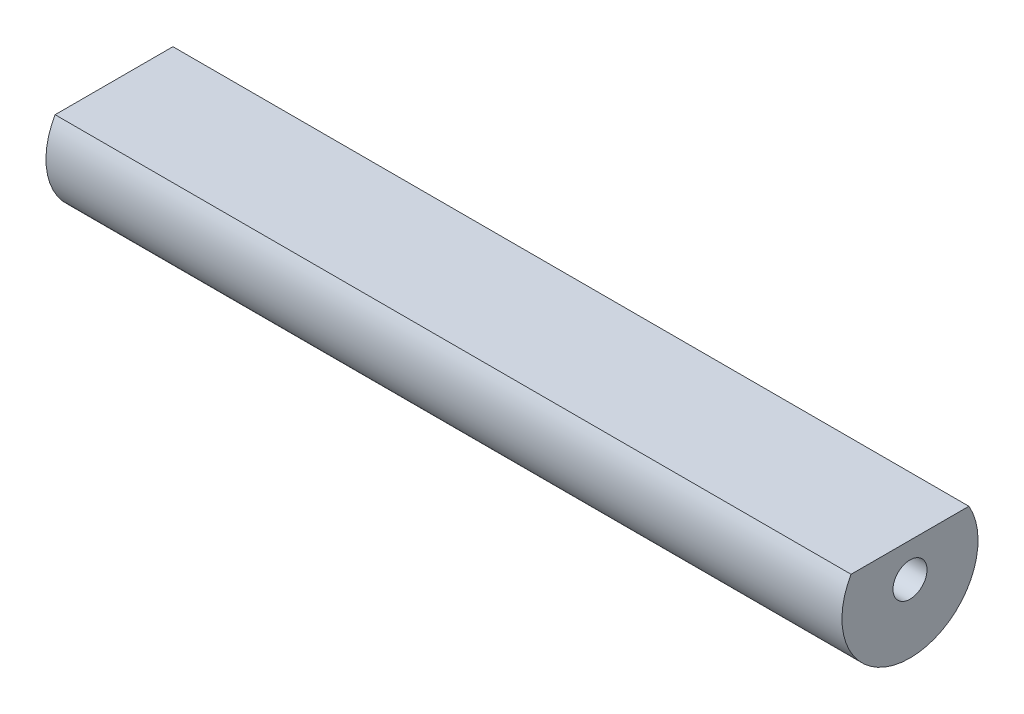
ISO-10303-21;
HEADER;
FILE_DESCRIPTION(('STEP AP214'),'2;1');
FILE_NAME('part.step','',(''),(''),'','','');
FILE_SCHEMA(('AUTOMOTIVE_DESIGN { 1 0 10303 214 1 1 1 1 }'));
ENDSEC;
DATA;
#1=APPLICATION_CONTEXT('core data for automotive mechanical design processes');
#2=APPLICATION_PROTOCOL_DEFINITION('international standard','automotive_design',2000,#1);
#3=PRODUCT_CONTEXT('',#1,'mechanical');
#4=PRODUCT('Part','Part','',(#3));
#5=PRODUCT_RELATED_PRODUCT_CATEGORY('part','',(#4));
#6=PRODUCT_DEFINITION_FORMATION('','',#4);
#7=PRODUCT_DEFINITION_CONTEXT('part definition',#1,'design');
#8=PRODUCT_DEFINITION('design','',#6,#7);
#9=PRODUCT_DEFINITION_SHAPE('','',#8);
#10=(LENGTH_UNIT() NAMED_UNIT(*) SI_UNIT(.MILLI.,.METRE.));
#11=(NAMED_UNIT(*) PLANE_ANGLE_UNIT() SI_UNIT($,.RADIAN.));
#12=(NAMED_UNIT(*) SI_UNIT($,.STERADIAN.) SOLID_ANGLE_UNIT());
#13=UNCERTAINTY_MEASURE_WITH_UNIT(LENGTH_MEASURE(1.E-05),#10,'distance_accuracy_value','');
#14=(GEOMETRIC_REPRESENTATION_CONTEXT(3) GLOBAL_UNCERTAINTY_ASSIGNED_CONTEXT((#13)) GLOBAL_UNIT_ASSIGNED_CONTEXT((#10,
#11,#12)) REPRESENTATION_CONTEXT('',''));
#15=CARTESIAN_POINT('',(0.,0.,0.));
#16=DIRECTION('',(0.,0.,1.));
#17=DIRECTION('',(1.,0.,0.));
#18=AXIS2_PLACEMENT_3D('',#15,#16,#17);
#19=CARTESIAN_POINT('',(0.,0.,0.));
#20=DIRECTION('',(1.,0.,0.));
#21=DIRECTION('',(0.,1.,0.));
#22=AXIS2_PLACEMENT_3D('',#19,#20,#21);
#23=PLANE('',#22);
#24=DIRECTION('',(0.,0.,-1.));
#25=VECTOR('',#24,1.);
#26=CARTESIAN_POINT('',(0.,5.00000000000002,10.));
#27=LINE('',#26,#25);
#28=CARTESIAN_POINT('',(0.,5.00000000000002,8.66025403784439));
#29=VERTEX_POINT('',#28);
#30=CARTESIAN_POINT('',(0.,5.00000000000002,-8.66025403784439));
#31=VERTEX_POINT('',#30);
#32=EDGE_CURVE('E51',#29,#31,#27,.T.);
#33=ORIENTED_EDGE('',*,*,#32,.F.);
#34=CARTESIAN_POINT('',(0.,0.,0.));
#35=DIRECTION('',(1.,0.,0.));
#36=DIRECTION('',(0.,1.,0.));
#37=AXIS2_PLACEMENT_3D('',#34,#35,#36);
#38=CIRCLE('',#37,10.);
#39=EDGE_CURVE('E11',#29,#31,#38,.T.);
#40=ORIENTED_EDGE('',*,*,#39,.T.);
#41=EDGE_LOOP('',(#33,#40));
#42=FACE_BOUND('',#41,.T.);
#43=CARTESIAN_POINT('',(0.,0.,0.));
#44=DIRECTION('',(1.,0.,0.));
#45=DIRECTION('',(0.,1.,0.));
#46=AXIS2_PLACEMENT_3D('',#43,#44,#45);
#47=CIRCLE('',#46,2.5);
#48=CARTESIAN_POINT('',(0.,2.5,0.));
#49=VERTEX_POINT('',#48);
#50=EDGE_CURVE('E70',#49,#49,#47,.T.);
#51=ORIENTED_EDGE('',*,*,#50,.F.);
#52=EDGE_LOOP('',(#51));
#53=FACE_BOUND('',#52,.T.);
#54=ADVANCED_FACE('F32',(#42,#53),#23,.T.);
#55=CARTESIAN_POINT('',(0.,0.,0.));
#56=DIRECTION('',(1.,0.,0.));
#57=DIRECTION('',(0.,1.,0.));
#58=AXIS2_PLACEMENT_3D('',#55,#56,#57);
#59=CYLINDRICAL_SURFACE('',#58,10.);
#60=DIRECTION('',(1.,0.,0.));
#61=VECTOR('',#60,1.);
#62=CARTESIAN_POINT('',(0.,5.00000000000002,-8.66025403784439));
#63=LINE('',#62,#61);
#64=CARTESIAN_POINT('',(-117.,5.00000000000002,-8.66025403784438));
#65=VERTEX_POINT('',#64);
#66=EDGE_CURVE('E46',#65,#31,#63,.T.);
#67=ORIENTED_EDGE('',*,*,#66,.T.);
#68=ORIENTED_EDGE('',*,*,#39,.F.);
#69=DIRECTION('',(1.,0.,0.));
#70=VECTOR('',#69,1.);
#71=CARTESIAN_POINT('',(0.,5.00000000000002,8.66025403784439));
#72=LINE('',#71,#70);
#73=CARTESIAN_POINT('',(-117.,5.00000000000002,8.66025403784438));
#74=VERTEX_POINT('',#73);
#75=EDGE_CURVE('E58',#29,#74,#72,.F.);
#76=ORIENTED_EDGE('',*,*,#75,.T.);
#77=CARTESIAN_POINT('',(-117.,0.,0.));
#78=DIRECTION('',(1.,0.,0.));
#79=DIRECTION('',(0.,1.,0.));
#80=AXIS2_PLACEMENT_3D('',#77,#78,#79);
#81=CIRCLE('',#80,10.);
#82=EDGE_CURVE('E39',#74,#65,#81,.T.);
#83=ORIENTED_EDGE('',*,*,#82,.T.);
#84=EDGE_LOOP('',(#67,#68,#76,#83));
#85=FACE_BOUND('',#84,.T.);
#86=ADVANCED_FACE('F66',(#85),#59,.T.);
#87=CARTESIAN_POINT('',(-117.,0.,0.));
#88=DIRECTION('',(-1.,0.,0.));
#89=DIRECTION('',(0.,-1.,0.));
#90=AXIS2_PLACEMENT_3D('',#87,#88,#89);
#91=PLANE('',#90);
#92=DIRECTION('',(0.,0.,-1.));
#93=VECTOR('',#92,1.);
#94=CARTESIAN_POINT('',(-117.,5.00000000000002,10.));
#95=LINE('',#94,#93);
#96=EDGE_CURVE('E55',#74,#65,#95,.T.);
#97=ORIENTED_EDGE('',*,*,#96,.T.);
#98=ORIENTED_EDGE('',*,*,#82,.F.);
#99=EDGE_LOOP('',(#97,#98));
#100=FACE_BOUND('',#99,.T.);
#101=CARTESIAN_POINT('',(-117.,0.,0.));
#102=DIRECTION('',(-1.,0.,0.));
#103=DIRECTION('',(0.,-1.,0.));
#104=AXIS2_PLACEMENT_3D('',#101,#102,#103);
#105=CIRCLE('',#104,2.5);
#106=CARTESIAN_POINT('',(-117.,-2.5,0.));
#107=VERTEX_POINT('',#106);
#108=EDGE_CURVE('E62',#107,#107,#105,.F.);
#109=ORIENTED_EDGE('',*,*,#108,.T.);
#110=EDGE_LOOP('',(#109));
#111=FACE_BOUND('',#110,.T.);
#112=ADVANCED_FACE('F68',(#100,#111),#91,.T.);
#113=CARTESIAN_POINT('',(-117.001,0.,0.));
#114=DIRECTION('',(1.,0.,0.));
#115=DIRECTION('',(0.,1.,0.));
#116=AXIS2_PLACEMENT_3D('',#113,#114,#115);
#117=CYLINDRICAL_SURFACE('',#116,2.5);
#118=ORIENTED_EDGE('',*,*,#108,.F.);
#119=EDGE_LOOP('',(#118));
#120=FACE_BOUND('',#119,.T.);
#121=ORIENTED_EDGE('',*,*,#50,.T.);
#122=EDGE_LOOP('',(#121));
#123=FACE_BOUND('',#122,.T.);
#124=ADVANCED_FACE('F82',(#120,#123),#117,.F.);
#125=CARTESIAN_POINT('',(-117.001,5.00000000000002,10.));
#126=DIRECTION('',(0.,-1.,0.));
#127=DIRECTION('',(1.,0.,0.));
#128=AXIS2_PLACEMENT_3D('',#125,#126,#127);
#129=PLANE('',#128);
#130=ORIENTED_EDGE('',*,*,#96,.F.);
#131=ORIENTED_EDGE('',*,*,#75,.F.);
#132=ORIENTED_EDGE('',*,*,#32,.T.);
#133=ORIENTED_EDGE('',*,*,#66,.F.);
#134=EDGE_LOOP('',(#130,#131,#132,#133));
#135=FACE_BOUND('',#134,.T.);
#136=ADVANCED_FACE('F57',(#135),#129,.F.);
#137=CLOSED_SHELL('',(#54,#86,#112,#124,#136));
#138=MANIFOLD_SOLID_BREP('B2',#137);
#139=ADVANCED_BREP_SHAPE_REPRESENTATION('',(#18,#138),#14);
#140=SHAPE_DEFINITION_REPRESENTATION(#9,#139);
ENDSEC;
END-ISO-10303-21;
